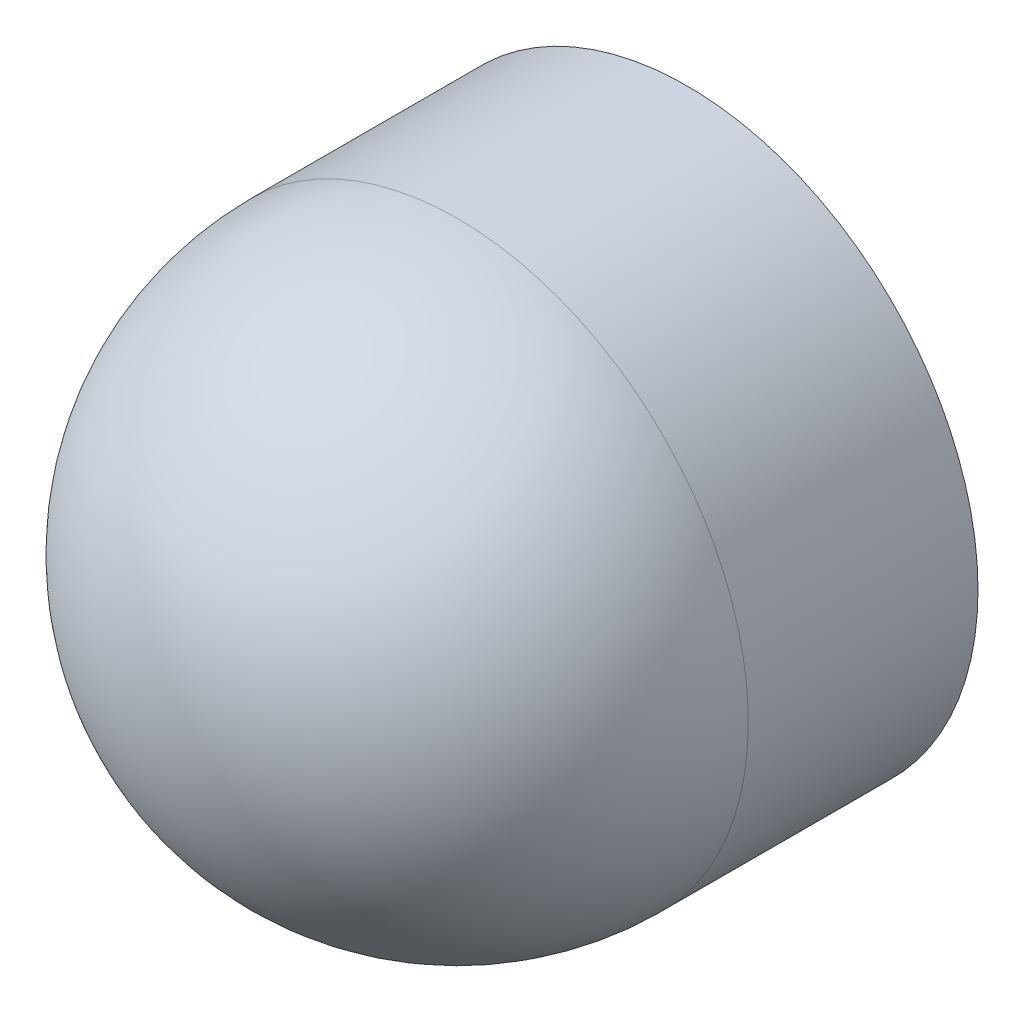
ISO-10303-21;
HEADER;
FILE_DESCRIPTION(('STEP AP214'),'2;1');
FILE_NAME('part.step','',(''),(''),'','','');
FILE_SCHEMA(('AUTOMOTIVE_DESIGN { 1 0 10303 214 1 1 1 1 }'));
ENDSEC;
DATA;
#1=APPLICATION_CONTEXT('core data for automotive mechanical design processes');
#2=APPLICATION_PROTOCOL_DEFINITION('international standard','automotive_design',2000,#1);
#3=PRODUCT_CONTEXT('',#1,'mechanical');
#4=PRODUCT('Part','Part','',(#3));
#5=PRODUCT_RELATED_PRODUCT_CATEGORY('part','',(#4));
#6=PRODUCT_DEFINITION_FORMATION('','',#4);
#7=PRODUCT_DEFINITION_CONTEXT('part definition',#1,'design');
#8=PRODUCT_DEFINITION('design','',#6,#7);
#9=PRODUCT_DEFINITION_SHAPE('','',#8);
#10=(LENGTH_UNIT() NAMED_UNIT(*) SI_UNIT(.MILLI.,.METRE.));
#11=(NAMED_UNIT(*) PLANE_ANGLE_UNIT() SI_UNIT($,.RADIAN.));
#12=(NAMED_UNIT(*) SI_UNIT($,.STERADIAN.) SOLID_ANGLE_UNIT());
#13=UNCERTAINTY_MEASURE_WITH_UNIT(LENGTH_MEASURE(1.E-05),#10,'distance_accuracy_value','');
#14=(GEOMETRIC_REPRESENTATION_CONTEXT(3) GLOBAL_UNCERTAINTY_ASSIGNED_CONTEXT((#13)) GLOBAL_UNIT_ASSIGNED_CONTEXT((#10,
#11,#12)) REPRESENTATION_CONTEXT('',''));
#15=CARTESIAN_POINT('',(0.,0.,0.));
#16=DIRECTION('',(0.,0.,1.));
#17=DIRECTION('',(1.,0.,0.));
#18=AXIS2_PLACEMENT_3D('',#15,#16,#17);
#19=CARTESIAN_POINT('',(0.,0.,0.));
#20=DIRECTION('',(0.,0.,-1.));
#21=DIRECTION('',(-1.,0.,0.));
#22=AXIS2_PLACEMENT_3D('',#19,#20,#21);
#23=PLANE('',#22);
#24=CARTESIAN_POINT('',(0.,0.,0.));
#25=DIRECTION('',(0.,0.,-1.));
#26=DIRECTION('',(-1.,0.,0.));
#27=AXIS2_PLACEMENT_3D('',#24,#25,#26);
#28=CIRCLE('',#27,9.652);
#29=CARTESIAN_POINT('',(-9.652,0.,0.));
#30=VERTEX_POINT('',#29);
#31=EDGE_CURVE('E10',#30,#30,#28,.T.);
#32=ORIENTED_EDGE('',*,*,#31,.T.);
#33=EDGE_LOOP('',(#32));
#34=FACE_BOUND('',#33,.T.);
#35=ADVANCED_FACE('F37',(#34),#23,.T.);
#36=CARTESIAN_POINT('',(0.,0.,7.62));
#37=DIRECTION('',(0.,0.,-1.));
#38=DIRECTION('',(-1.,0.,0.));
#39=AXIS2_PLACEMENT_3D('',#36,#37,#38);
#40=CYLINDRICAL_SURFACE('',#39,9.652);
#41=CARTESIAN_POINT('',(0.,0.,7.62));
#42=DIRECTION('',(0.,0.,-1.));
#43=DIRECTION('',(-1.,0.,0.));
#44=AXIS2_PLACEMENT_3D('',#41,#42,#43);
#45=CIRCLE('',#44,9.652);
#46=CARTESIAN_POINT('',(-9.652,0.,7.62));
#47=VERTEX_POINT('',#46);
#48=EDGE_CURVE('E43',#47,#47,#45,.T.);
#49=ORIENTED_EDGE('',*,*,#48,.T.);
#50=EDGE_LOOP('',(#49));
#51=FACE_BOUND('',#50,.T.);
#52=ORIENTED_EDGE('',*,*,#31,.F.);
#53=EDGE_LOOP('',(#52));
#54=FACE_BOUND('',#53,.T.);
#55=ADVANCED_FACE('F49',(#51,#54),#40,.T.);
#56=CARTESIAN_POINT('',(0.,0.,7.62));
#57=DIRECTION('',(0.,0.,-1.));
#58=DIRECTION('',(0.,1.,0.));
#59=AXIS2_PLACEMENT_3D('',#56,#57,#58);
#60=SPHERICAL_SURFACE('',#59,9.652);
#61=ORIENTED_EDGE('',*,*,#48,.F.);
#62=EDGE_LOOP('',(#61));
#63=FACE_BOUND('',#62,.T.);
#64=ADVANCED_FACE('F52',(#63),#60,.T.);
#65=CLOSED_SHELL('',(#35,#55,#64));
#66=MANIFOLD_SOLID_BREP('B2',#65);
#67=ADVANCED_BREP_SHAPE_REPRESENTATION('',(#18,#66),#14);
#68=SHAPE_DEFINITION_REPRESENTATION(#9,#67);
ENDSEC;
END-ISO-10303-21;
